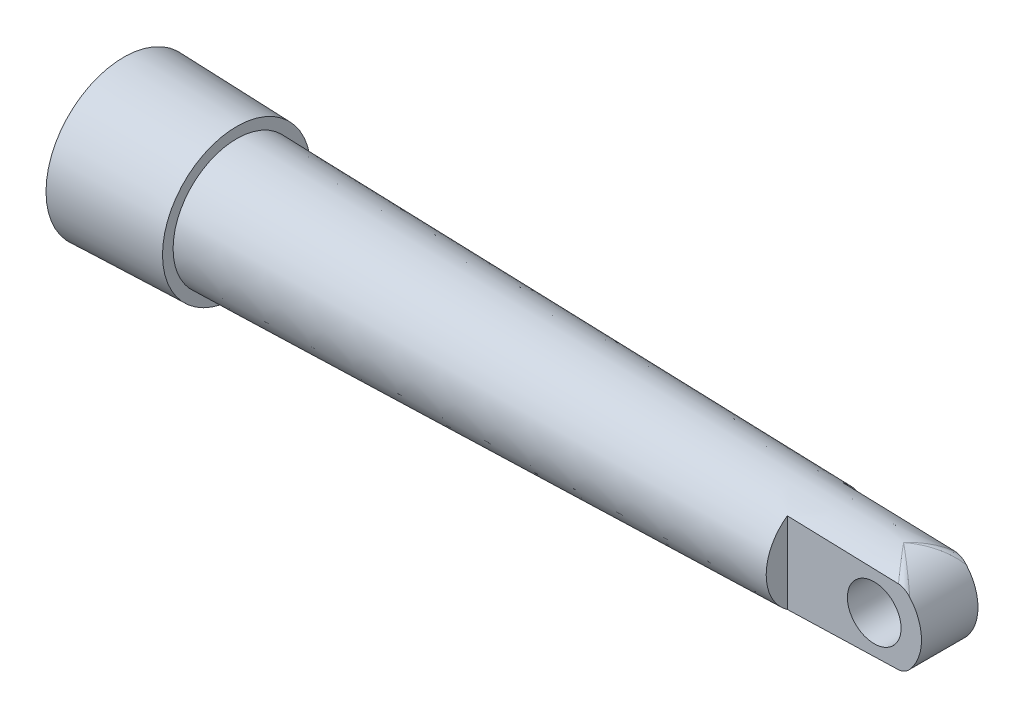
ISO-10303-21;
HEADER;
FILE_DESCRIPTION(('STEP AP214'),'2;1');
FILE_NAME('part.step','',(''),(''),'','','');
FILE_SCHEMA(('AUTOMOTIVE_DESIGN { 1 0 10303 214 1 1 1 1 }'));
ENDSEC;
DATA;
#1=APPLICATION_CONTEXT('core data for automotive mechanical design processes');
#2=APPLICATION_PROTOCOL_DEFINITION('international standard','automotive_design',2000,#1);
#3=PRODUCT_CONTEXT('',#1,'mechanical');
#4=PRODUCT('Part','Part','',(#3));
#5=PRODUCT_RELATED_PRODUCT_CATEGORY('part','',(#4));
#6=PRODUCT_DEFINITION_FORMATION('','',#4);
#7=PRODUCT_DEFINITION_CONTEXT('part definition',#1,'design');
#8=PRODUCT_DEFINITION('design','',#6,#7);
#9=PRODUCT_DEFINITION_SHAPE('','',#8);
#10=(LENGTH_UNIT() NAMED_UNIT(*) SI_UNIT(.MILLI.,.METRE.));
#11=(NAMED_UNIT(*) PLANE_ANGLE_UNIT() SI_UNIT($,.RADIAN.));
#12=(NAMED_UNIT(*) SI_UNIT($,.STERADIAN.) SOLID_ANGLE_UNIT());
#13=UNCERTAINTY_MEASURE_WITH_UNIT(LENGTH_MEASURE(1.E-05),#10,'distance_accuracy_value','');
#14=(GEOMETRIC_REPRESENTATION_CONTEXT(3) GLOBAL_UNCERTAINTY_ASSIGNED_CONTEXT((#13)) GLOBAL_UNIT_ASSIGNED_CONTEXT((#10,
#11,#12)) REPRESENTATION_CONTEXT('',''));
#15=CARTESIAN_POINT('',(0.,0.,0.));
#16=DIRECTION('',(0.,0.,1.));
#17=DIRECTION('',(1.,0.,0.));
#18=AXIS2_PLACEMENT_3D('',#15,#16,#17);
#19=CARTESIAN_POINT('',(27.5755104392082,0.,1.));
#20=DIRECTION('',(0.,0.,-1.));
#21=DIRECTION('',(-1.,0.,0.));
#22=AXIS2_PLACEMENT_3D('',#19,#20,#21);
#23=CYLINDRICAL_SURFACE('',#22,1.67448956079173);
#24=CARTESIAN_POINT('',(27.6163395055344,-1.67399171937721,0.));
#25=CARTESIAN_POINT('',(27.6163395055344,-1.67399171937721,0.));
#26=CARTESIAN_POINT('',(27.6163395055344,-1.67399171937721,0.));
#27=CARTESIAN_POINT('',(27.618467865516,-1.67393979547313,0.00174756455215632));
#28=CARTESIAN_POINT('',(27.6182772330823,-1.67394453160652,0.00193830383247855));
#29=CARTESIAN_POINT('',(27.6180865505114,-1.67394909581258,0.00212899180087379));
#30=CARTESIAN_POINT('',(27.6205963328864,-1.67388382036366,0.00349521727959526));
#31=CARTESIAN_POINT('',(27.6202150553893,-1.67389393219173,0.0038767024519865));
#32=CARTESIAN_POINT('',(27.6198336836377,-1.67390242153977,0.00425812769129189));
#33=CARTESIAN_POINT('',(27.8100496928767,-1.66854091525993,0.159052537947357));
#34=CARTESIAN_POINT('',(27.7927353072141,-1.66908591804656,0.17644826215915));
#35=CARTESIAN_POINT('',(27.7753447549881,-1.66938736127527,0.193774251036814));
#36=CARTESIAN_POINT('',(27.9981180453064,-1.63186028062121,0.313472648395745));
#37=CARTESIAN_POINT('',(27.9672353647476,-1.63757540436189,0.35100021500491));
#38=CARTESIAN_POINT('',(27.9297189554504,-1.63352712830547,0.382188470900751));
#39=CARTESIAN_POINT('',(28.2729335062419,-1.52565855161667,0.539119512416358));
#40=CARTESIAN_POINT('',(28.2202491945803,-1.5493387084512,0.604089290367832));
#41=CARTESIAN_POINT('',(28.1552987327416,-1.5283072420202,0.657901676800925));
#42=CARTESIAN_POINT('',(28.3648144755129,-1.48049703553556,0.614561601954931));
#43=CARTESIAN_POINT('',(28.306939142704,-1.51081510793,0.690805019945252));
#44=CARTESIAN_POINT('',(28.2307183925923,-1.48343417020061,0.750154804736638));
#45=CARTESIAN_POINT('',(28.542495965342,-1.3710128277063,0.760453215484456));
#46=CARTESIAN_POINT('',(28.4768648805257,-1.41693128005956,0.860781293345288));
#47=CARTESIAN_POINT('',(28.3765666311448,-1.37438521815399,0.928681207969344));
#48=CARTESIAN_POINT('',(28.6283197595258,-1.306769046583,0.830921849101678));
#49=CARTESIAN_POINT('',(28.5608616538924,-1.36063118457362,0.944803047149651));
#50=CARTESIAN_POINT('',(28.4470143137911,-1.31028882147814,1.01497734036455));
#51=CARTESIAN_POINT('',(28.7682063648431,-1.17804114166466,0.945780648261226));
#52=CARTESIAN_POINT('',(28.7005017863147,-1.24652107272812,1.08448470822755));
#53=CARTESIAN_POINT('',(28.5618389643624,-1.18165204916012,1.15572352149003));
#54=CARTESIAN_POINT('',(28.824514944723,-1.11847711627069,0.992014780924313));
#55=CARTESIAN_POINT('',(28.7583506370559,-1.19228819026752,1.14235076309022));
#56=CARTESIAN_POINT('',(28.6080593511837,-1.12207661067537,1.21240704281805));
#57=CARTESIAN_POINT('',(28.9304150161074,-0.987542432931758,1.07896774546127));
#58=CARTESIAN_POINT('',(28.870393646757,-1.07002880140056,1.25442709413737));
#59=CARTESIAN_POINT('',(28.6949864637875,-0.991005736391476,1.31905521106677));
#60=CARTESIAN_POINT('',(28.9799581084631,-0.916094068933119,1.11964683751816));
#61=CARTESIAN_POINT('',(28.9244893423867,-1.00134543268917,1.30853887770884));
#62=CARTESIAN_POINT('',(28.7356534615681,-0.919431822382247,1.36897142924673));
#63=CARTESIAN_POINT('',(29.0248446542775,-0.838657034925327,1.15650250885894));
#64=CARTESIAN_POINT('',(28.9742150615907,-0.926153112487724,1.35827938522685));
#65=CARTESIAN_POINT('',(28.7724981753761,-0.841805144419177,1.4142127847288));
#66=(BOUNDED_SURFACE() B_SPLINE_SURFACE(3,2,((#24,#25,#26),(#27,#28,#29),(#30,#31,#32),(#33,#34,
#35),(#36,#37,#38),(#39,#40,#41),(#42,#43,#44),(#45,#46,#47),(#48,#49,#50),(#51,#52,#53),(#54,
#55,#56),(#57,#58,#59),(#60,#61,#62),(#63,#64,#65)),.UNSPECIFIED.,.F.,.F.,
.F.) B_SPLINE_SURFACE_WITH_KNOTS((4,2,2,2,2,2,4),(3,3),(0.,0.00741482855342208,
0.659958824360603,0.997893522332798,1.33444977115564,1.5784949884056,1.82420360149986),(0.,1.),
.UNSPECIFIED.) GEOMETRIC_REPRESENTATION_ITEM() RATIONAL_B_SPLINE_SURFACE(((1.,1.,1.),(1.,
1.00000002001633,1.),(1.,0.999998807206265,1.),(1.,0.999781180759512,1.),(1.,0.990022032599264,
1.),(1.,0.961281322477562,1.),(1.,0.949014620749126,1.),(1.,0.920059473197017,1.),(1.,
0.903389267944706,1.),(1.,0.871801208689535,1.),(1.,0.857661218515058,1.),(1.,0.8286475690322,
1.),(1.,0.813769565984882,1.),(1.,0.799125837858268,1.))) REPRESENTATION_ITEM('') SURFACE());
#67=CARTESIAN_POINT('',(29.0248446542775,-0.838657034925327,1.15650250885894));
#68=CARTESIAN_POINT('',(28.9799581084631,-0.916094068933119,1.11964683751816));
#69=CARTESIAN_POINT('',(28.9304150161074,-0.987542432931758,1.07896774546127));
#70=CARTESIAN_POINT('',(28.824514944723,-1.11847711627069,0.992014780924313));
#71=CARTESIAN_POINT('',(28.7682063648431,-1.17804114166466,0.945780648261226));
#72=CARTESIAN_POINT('',(28.6283197595258,-1.306769046583,0.830921849101678));
#73=CARTESIAN_POINT('',(28.542495965342,-1.3710128277063,0.760453215484456));
#74=CARTESIAN_POINT('',(28.3648144755129,-1.48049703553556,0.614561601954931));
#75=CARTESIAN_POINT('',(28.2729335062419,-1.52565855161667,0.539119512416358));
#76=CARTESIAN_POINT('',(27.9981180453064,-1.63186028062121,0.313472648395745));
#77=CARTESIAN_POINT('',(27.8100496928767,-1.66854091525993,0.159052537947356));
#78=CARTESIAN_POINT('',(27.6205963328864,-1.67388382036366,0.00349521727959526));
#79=CARTESIAN_POINT('',(27.618467865516,-1.67393979547313,0.00174756455215632));
#80=CARTESIAN_POINT('',(27.6163395055344,-1.67399171937721,0.));
#81=B_SPLINE_CURVE_WITH_KNOTS('',3,(#67,#68,#69,#70,#71,#72,#73,#74,#75,#76,#77,#78,#79,#80),
.UNSPECIFIED.,.F.,.F.,(4,2,2,2,2,2,4),(0.,0.245708613094263,0.489753830344219,0.826310079167065,
1.16424477713926,1.81678877294644,1.82420360149986),.UNSPECIFIED.);
#82=CARTESIAN_POINT('',(28.8342401481649,-1.10431644422697,1.));
#83=VERTEX_POINT('',#82);
#84=CARTESIAN_POINT('',(27.6163395055344,-1.6739917193772,0.));
#85=VERTEX_POINT('',#84);
#86=EDGE_CURVE('E282',#83,#85,#81,.T.);
#87=ORIENTED_EDGE('',*,*,#86,.T.);
#88=CARTESIAN_POINT('',(27.6163395055344,-1.67399171937721,0.));
#89=CARTESIAN_POINT('',(27.6163395055344,-1.67399171937721,0.));
#90=CARTESIAN_POINT('',(27.6163395055344,-1.67399171937721,0.));
#91=CARTESIAN_POINT('',(27.6180865717008,-1.6739490965478,-0.00212901787747613));
#92=CARTESIAN_POINT('',(27.6182772481117,-1.67394451598897,-0.00193831885895451));
#93=CARTESIAN_POINT('',(27.6184678913302,-1.67393979610002,-0.00174758574121267));
#94=CARTESIAN_POINT('',(27.61983370472,-1.67390242220252,-0.00425815362703669));
#95=CARTESIAN_POINT('',(27.6202150703969,-1.67389391669551,-0.00387671744947991));
#96=CARTESIAN_POINT('',(27.6205963585702,-1.67388382091869,-0.00349523835504337));
#97=CARTESIAN_POINT('',(27.7590853330038,-1.66985933197192,-0.173959418116549));
#98=CARTESIAN_POINT('',(27.7746945755846,-1.66958988693492,-0.158402164601737));
#99=CARTESIAN_POINT('',(27.7902414432155,-1.66909944070916,-0.142788279856599));
#100=CARTESIAN_POINT('',(27.8969480134136,-1.64075553362338,-0.342193197571173));
#101=CARTESIAN_POINT('',(27.9299819662111,-1.64408919627779,-0.313735737268322));
#102=CARTESIAN_POINT('',(27.9581944242742,-1.6392628300472,-0.280691960244518));
#103=CARTESIAN_POINT('',(28.1082585022433,-1.55298683917737,-0.600386660038877));
#104=CARTESIAN_POINT('',(28.1666616555915,-1.57031837369283,-0.550485814627909));
#105=CARTESIAN_POINT('',(28.2156261412726,-1.55053227280001,-0.492065292313408));
#106=CARTESIAN_POINT('',(28.1843888754279,-1.51192678319757,-0.693480370503303));
#107=CARTESIAN_POINT('',(28.2537008605164,-1.53516689877234,-0.637550904828043));
#108=CARTESIAN_POINT('',(28.3083729461908,-1.50916096957166,-0.568218306509846));
#109=CARTESIAN_POINT('',(28.3321598012929,-1.41080178542038,-0.874306232748993));
#110=CARTESIAN_POINT('',(28.4246149048285,-1.44851705909491,-0.808515778603759));
#111=CARTESIAN_POINT('',(28.4883967745325,-1.40754473328141,-0.716033179125432));
#112=CARTESIAN_POINT('',(28.4038146649473,-1.35080157408243,-0.962055449159446));
#113=CARTESIAN_POINT('',(28.5092791373598,-1.39615025509978,-0.893205190086917));
#114=CARTESIAN_POINT('',(28.575691232484,-1.34736409042303,-0.787709352774784));
#115=CARTESIAN_POINT('',(28.5231997471348,-1.22759535321225,-1.1083512756071));
#116=CARTESIAN_POINT('',(28.6528467576888,-1.28780037393155,-1.03681550710535));
#117=CARTESIAN_POINT('',(28.7211336421899,-1.22399908525472,-0.907129939818906));
#118=CARTESIAN_POINT('',(28.5724593764793,-1.16886565738249,-1.16874709952427));
#119=CARTESIAN_POINT('',(28.7137097505298,-1.23488468627934,-1.09769660046548));
#120=CARTESIAN_POINT('',(28.7811448183085,-1.16525204906687,-0.956404218867904));
#121=CARTESIAN_POINT('',(28.6655028556776,-1.03872160430523,-1.28287438816999));
#122=CARTESIAN_POINT('',(28.8319556770654,-1.11495681008573,-1.21597769307738));
#123=CARTESIAN_POINT('',(28.8944962318526,-1.03519193336653,-1.04947536899053));
#124=CARTESIAN_POINT('',(28.7092501618559,-0.967229486118558,-1.33656135930656));
#125=CARTESIAN_POINT('',(28.8893055860095,-1.04722320578215,-1.27334465775722));
#126=CARTESIAN_POINT('',(28.947791949476,-0.963801842673637,-1.09323568552067));
#127=CARTESIAN_POINT('',(28.7491691889188,-0.889214551320577,-1.38557006974672));
#128=CARTESIAN_POINT('',(28.9423211997568,-0.972728060609255,-1.32637603822938));
#129=CARTESIAN_POINT('',(28.9964238168984,-0.885957370476444,-1.13316658441293));
#130=(BOUNDED_SURFACE() B_SPLINE_SURFACE(3,2,((#88,#89,#90),(#91,#92,#93),(#94,#95,#96),(#97,
#98,#99),(#100,#101,#102),(#103,#104,#105),(#106,#107,#108),(#109,#110,#111),(#112,#113,#114),
(#115,#116,#117),(#118,#119,#120),(#121,#122,#123),(#124,#125,#126),(#127,#128,#129)),
.UNSPECIFIED.,.F.,.F.,.F.) B_SPLINE_SURFACE_WITH_KNOTS((4,2,2,2,2,2,4),(3,3),(0.,
0.00741482855311148,0.590964029095096,0.928825723040097,1.26554500889048,1.51884965246426,
1.77375390207447),(0.,1.),
.UNSPECIFIED.) GEOMETRIC_REPRESENTATION_ITEM() RATIONAL_B_SPLINE_SURFACE(((1.,1.,1.),(1.,
1.00000001480827,1.),(1.,0.999998802039772,1.),(1.,0.999804338923053,1.),(1.,0.99201160272251,
1.),(1.,0.968025575817148,1.),(1.,0.956750451752726,1.),(1.,0.929639219900715,1.),(1.,
0.913818663027909,1.),(1.,0.882919998060971,1.),(1.,0.868628855709581,1.),(1.,0.838952739397176,
1.),(1.,0.823561427855335,1.),(1.,0.808199336500256,1.))) REPRESENTATION_ITEM('') SURFACE());
#131=CARTESIAN_POINT('',(28.9964238168984,-0.885957370476444,-1.13316658441293));
#132=CARTESIAN_POINT('',(28.947791949476,-0.963801842673637,-1.09323568552067));
#133=CARTESIAN_POINT('',(28.8944962318526,-1.03519193336653,-1.04947536899053));
#134=CARTESIAN_POINT('',(28.7811448183085,-1.16525204906687,-0.956404218867903));
#135=CARTESIAN_POINT('',(28.7211336421899,-1.22399908525472,-0.907129939818906));
#136=CARTESIAN_POINT('',(28.575691232484,-1.34736409042303,-0.787709352774784));
#137=CARTESIAN_POINT('',(28.4883967745325,-1.40754473328141,-0.716033179125432));
#138=CARTESIAN_POINT('',(28.3083729461908,-1.50916096957166,-0.568218306509846));
#139=CARTESIAN_POINT('',(28.2156261412726,-1.55053227280001,-0.492065292313408));
#140=CARTESIAN_POINT('',(27.9581944242741,-1.6392628300472,-0.280691960244518));
#141=CARTESIAN_POINT('',(27.7902414432155,-1.66909944070916,-0.142788279856601));
#142=CARTESIAN_POINT('',(27.6205963585702,-1.67388382091869,-0.00349523835504337));
#143=CARTESIAN_POINT('',(27.6184678913302,-1.67393979610002,-0.00174758574121267));
#144=CARTESIAN_POINT('',(27.6163395055344,-1.67399171937721,0.));
#145=B_SPLINE_CURVE_WITH_KNOTS('',3,(#131,#132,#133,#134,#135,#136,#137,#138,#139,#140,#141,
#142,#143,#144),.UNSPECIFIED.,.F.,.F.,(4,2,2,2,2,2,4),(0.,0.254904249610207,0.508208893183989,
0.844928179034372,1.18278987297937,1.76633907352136,1.77375390207447),.UNSPECIFIED.);
#146=CARTESIAN_POINT('',(28.834240148164,-1.10431644422803,-1.));
#147=VERTEX_POINT('',#146);
#148=EDGE_CURVE('E62',#85,#147,#145,.F.);
#149=ORIENTED_EDGE('',*,*,#148,.T.);
#150=CARTESIAN_POINT('',(27.5755104392082,0.,-1.));
#151=DIRECTION('',(0.,0.,1.));
#152=DIRECTION('',(1.,0.,0.));
#153=AXIS2_PLACEMENT_3D('',#150,#151,#152);
#154=CIRCLE('',#153,1.67448956079173);
#155=CARTESIAN_POINT('',(28.8342401481649,1.10431644422698,-1.));
#156=VERTEX_POINT('',#155);
#157=EDGE_CURVE('E138',#147,#156,#154,.T.);
#158=ORIENTED_EDGE('',*,*,#157,.T.);
#159=CARTESIAN_POINT('',(27.6163395055344,1.67399171937718,0.));
#160=CARTESIAN_POINT('',(27.6163395055344,1.6739917193772,0.));
#161=CARTESIAN_POINT('',(27.6163395055344,1.67399171937721,0.));
#162=CARTESIAN_POINT('',(27.6184678655146,1.67393979547315,-0.00174756455328493));
#163=CARTESIAN_POINT('',(27.6182772330811,1.67394453160654,-0.00193830383373032));
#164=CARTESIAN_POINT('',(27.6180865505103,1.6739490958126,-0.00212899180224874));
#165=CARTESIAN_POINT('',(27.6205963328837,1.67388382036371,-0.00349521728182946));
#166=CARTESIAN_POINT('',(27.6202150553868,1.67389393219177,-0.00387670245446452));
#167=CARTESIAN_POINT('',(27.6198336836354,1.67390242153982,-0.00425812769401374));
#168=CARTESIAN_POINT('',(27.8100496927564,1.6685409152633,-0.159052538045979));
#169=CARTESIAN_POINT('',(27.7927353071045,1.6690859180492,-0.176448262268558));
#170=CARTESIAN_POINT('',(27.7753447548892,1.66938736127723,-0.193774251156961));
#171=CARTESIAN_POINT('',(27.9981180452837,1.63186028062186,-0.313472648414101));
#172=CARTESIAN_POINT('',(27.9672353647267,1.63757540436241,-0.351000215025471));
#173=CARTESIAN_POINT('',(27.9297189554318,1.63352712830585,-0.382188470923113));
#174=CARTESIAN_POINT('',(28.2729335062533,1.52565855161642,-0.539119512406684));
#175=CARTESIAN_POINT('',(28.2202491945912,1.549338708451,-0.604089290356672));
#176=CARTESIAN_POINT('',(28.155298732751,1.52830724202009,-0.657901676789139));
#177=CARTESIAN_POINT('',(28.3648144755158,1.48049703553555,-0.614561601952296));
#178=CARTESIAN_POINT('',(28.3069391427068,1.51081510792999,-0.690805019942174));
#179=CARTESIAN_POINT('',(28.2307183925947,1.48343417020062,-0.750154804733427));
#180=CARTESIAN_POINT('',(28.5424959653387,1.37101282770647,-0.760453215486885));
#181=CARTESIAN_POINT('',(28.4768648805225,1.41693128005971,-0.860781293348218));
#182=CARTESIAN_POINT('',(28.3765666311421,1.37438521815412,-0.928681207972303));
#183=CARTESIAN_POINT('',(28.6283197595249,1.30676904658315,-0.830921849102174));
#184=CARTESIAN_POINT('',(28.5608616538914,1.36063118457375,-0.944803047150262));
#185=CARTESIAN_POINT('',(28.4470143137904,1.31028882147828,-1.01497734036515));
#186=CARTESIAN_POINT('',(28.7682063648434,1.17804114166485,-0.945780648260609));
#187=CARTESIAN_POINT('',(28.7005017863151,1.24652107272829,-1.08448470822677));
#188=CARTESIAN_POINT('',(28.5618389643627,1.18165204916031,-1.15572352148927));
#189=CARTESIAN_POINT('',(28.8245149447231,1.11847711627094,-0.992014780923907));
#190=CARTESIAN_POINT('',(28.7583506370559,1.19228819026774,-1.14235076308969));
#191=CARTESIAN_POINT('',(28.6080593511837,1.12207661067561,-1.21240704281756));
#192=CARTESIAN_POINT('',(28.9304150161069,0.987542432932033,-1.07896774546134));
#193=CARTESIAN_POINT('',(28.8703936467564,1.07002880140082,-1.25442709413748));
#194=CARTESIAN_POINT('',(28.6949864637871,0.991005736391741,-1.31905521106686));
#195=CARTESIAN_POINT('',(28.9799581084624,0.916094068933365,-1.1196468375185));
#196=CARTESIAN_POINT('',(28.9244893423859,1.00134543268941,-1.3085388777093));
#197=CARTESIAN_POINT('',(28.7356534615675,0.91943182238248,-1.36897142924715));
#198=CARTESIAN_POINT('',(29.0248446542774,0.838657034925511,-1.15650250885886));
#199=CARTESIAN_POINT('',(28.9742150615905,0.926153112487903,-1.35827938522673));
#200=CARTESIAN_POINT('',(28.772498175376,0.841805144419355,-1.4142127847287));
#201=(BOUNDED_SURFACE() B_SPLINE_SURFACE(3,2,((#159,#160,#161),(#162,#163,#164),(#165,#166,
#167),(#168,#169,#170),(#171,#172,#173),(#174,#175,#176),(#177,#178,#179),(#180,#181,#182),
(#183,#184,#185),(#186,#187,#188),(#189,#190,#191),(#192,#193,#194),(#195,#196,#197),(#198,#199,
#200)),.UNSPECIFIED.,.F.,.F.,.F.) B_SPLINE_SURFACE_WITH_KNOTS((4,2,2,2,2,2,4),(3,3),(0.,
0.00741482855341907,0.659958824360341,0.997893522332674,1.33444977115538,1.57849498840523,
1.82420360149967),(0.,1.),
.UNSPECIFIED.) GEOMETRIC_REPRESENTATION_ITEM() RATIONAL_B_SPLINE_SURFACE(((1.,1.,1.),(1.,
1.00000002001633,1.),(1.,0.999998807206265,1.),(1.,0.999781180759513,1.),(1.,0.990022032599272,
1.),(1.,0.961281322477586,1.),(1.,0.949014620749148,1.),(1.,0.920059473197042,1.),(1.,
0.90338926794474,1.),(1.,0.871801208689587,1.),(1.,0.857661218515119,1.),(1.,0.828647569032259,
1.),(1.,0.81376956598493,1.),(1.,0.799125837858304,1.))) REPRESENTATION_ITEM('') SURFACE());
#202=CARTESIAN_POINT('',(29.0248446542774,0.838657034925511,-1.15650250885886));
#203=CARTESIAN_POINT('',(28.9799581084624,0.916094068933365,-1.1196468375185));
#204=CARTESIAN_POINT('',(28.9304150161069,0.987542432932033,-1.07896774546134));
#205=CARTESIAN_POINT('',(28.8245149447231,1.11847711627094,-0.992014780923906));
#206=CARTESIAN_POINT('',(28.7682063648434,1.17804114166485,-0.945780648260609));
#207=CARTESIAN_POINT('',(28.6283197595249,1.30676904658315,-0.830921849102174));
#208=CARTESIAN_POINT('',(28.5424959653387,1.37101282770647,-0.760453215486885));
#209=CARTESIAN_POINT('',(28.3648144755158,1.48049703553555,-0.614561601952296));
#210=CARTESIAN_POINT('',(28.2729335062533,1.52565855161642,-0.539119512406684));
#211=CARTESIAN_POINT('',(27.9981180452837,1.63186028062186,-0.313472648414101));
#212=CARTESIAN_POINT('',(27.8100496927564,1.6685409152633,-0.159052538045978));
#213=CARTESIAN_POINT('',(27.6205963328837,1.67388382036371,-0.00349521728182946));
#214=CARTESIAN_POINT('',(27.6184678655146,1.67393979547315,-0.00174756455328493));
#215=CARTESIAN_POINT('',(27.6163395055344,1.67399171937718,0.));
#216=B_SPLINE_CURVE_WITH_KNOTS('',3,(#202,#203,#204,#205,#206,#207,#208,#209,#210,#211,#212,
#213,#214,#215),.UNSPECIFIED.,.F.,.F.,(4,2,2,2,2,2,4),(0.,0.245708613094438,0.489753830344288,
0.826310079166995,1.16424477713933,1.81678877294625,1.82420360149967),.UNSPECIFIED.);
#217=CARTESIAN_POINT('',(27.6163395055344,1.67399171937718,0.));
#218=VERTEX_POINT('',#217);
#219=EDGE_CURVE('E270',#156,#218,#216,.T.);
#220=ORIENTED_EDGE('',*,*,#219,.T.);
#221=CARTESIAN_POINT('',(27.6163395055344,1.67399171937721,0.));
#222=CARTESIAN_POINT('',(27.6163395055344,1.6739917193772,0.));
#223=CARTESIAN_POINT('',(27.6163395055344,1.67399171937718,0.));
#224=CARTESIAN_POINT('',(27.6180865716997,1.67394909654782,0.00212901787884273));
#225=CARTESIAN_POINT('',(27.6182772481105,1.67394451598899,0.00193831886019869));
#226=CARTESIAN_POINT('',(27.6184678913288,1.67393979610003,0.00174758574233443));
#227=CARTESIAN_POINT('',(27.6198337047178,1.67390242220257,0.00425815362973901));
#228=CARTESIAN_POINT('',(27.6202150703944,1.67389391669556,0.00387671745194016));
#229=CARTESIAN_POINT('',(27.6205963585675,1.67388382091874,0.00349523835726155));
#230=CARTESIAN_POINT('',(27.7590853329162,1.66985933197365,0.173959418223239));
#231=CARTESIAN_POINT('',(27.7746945754874,1.66958988693728,0.158402164698888));
#232=CARTESIAN_POINT('',(27.7902414431089,1.66909944071213,0.142788279944174));
#233=CARTESIAN_POINT('',(27.896948013396,1.64075553362372,0.342193197592568));
#234=CARTESIAN_POINT('',(27.9299819661914,1.64408919627826,0.313735737287957));
#235=CARTESIAN_POINT('',(27.9581944242527,1.6392628300478,0.28069196026208));
#236=CARTESIAN_POINT('',(28.1082585022534,1.55298683917715,0.600386660026578));
#237=CARTESIAN_POINT('',(28.1666616556031,1.57031837369253,0.550485814616341));
#238=CARTESIAN_POINT('',(28.2156261412849,1.55053227279965,0.492065292303313));
#239=CARTESIAN_POINT('',(28.1843888754306,1.51192678319748,0.693480370500103));
#240=CARTESIAN_POINT('',(28.2537008605195,1.53516689877223,0.637550904824997));
#241=CARTESIAN_POINT('',(28.3083729461941,1.50916096957154,0.568218306507219));
#242=CARTESIAN_POINT('',(28.3321598012902,1.41080178542038,0.874306232752352));
#243=CARTESIAN_POINT('',(28.4246149048253,1.44851705909495,0.808515778607044));
#244=CARTESIAN_POINT('',(28.4883967745292,1.40754473328146,0.716033179128188));
#245=CARTESIAN_POINT('',(28.4038146649467,1.35080157408241,0.962055449160306));
#246=CARTESIAN_POINT('',(28.5092791373589,1.39615025509978,0.893205190087771));
#247=CARTESIAN_POINT('',(28.5756912324832,1.34736409042303,0.78770935277549));
#248=CARTESIAN_POINT('',(28.5231997471353,1.22759535321227,1.10835127560644));
#249=CARTESIAN_POINT('',(28.6528467576894,1.28780037393156,1.03681550710468));
#250=CARTESIAN_POINT('',(28.7211336421905,1.22399908525474,0.90712993981837));
#251=CARTESIAN_POINT('',(28.5724593764795,1.16886565738255,1.16874709952389));
#252=CARTESIAN_POINT('',(28.7137097505301,1.2348846862794,1.09769660046508));
#253=CARTESIAN_POINT('',(28.7811448183087,1.16525204906694,0.956404218867593));
#254=CARTESIAN_POINT('',(28.6655028556773,1.03872160430532,1.28287438817024));
#255=CARTESIAN_POINT('',(28.831955677065,1.11495681008582,1.21597769307765));
#256=CARTESIAN_POINT('',(28.8944962318522,1.03519193336663,1.04947536899074));
#257=CARTESIAN_POINT('',(28.7092501618553,0.967229486118614,1.33656135930716));
#258=CARTESIAN_POINT('',(28.8893055860088,1.04722320578221,1.27334465775788));
#259=CARTESIAN_POINT('',(28.9477919494753,0.963801842673708,1.09323568552116));
#260=CARTESIAN_POINT('',(28.7491691889188,0.889214551320578,1.38557006974672));
#261=CARTESIAN_POINT('',(28.9423211997568,0.972728060609259,1.32637603822938));
#262=CARTESIAN_POINT('',(28.9964238168983,0.885957370476451,1.13316658441293));
#263=(BOUNDED_SURFACE() B_SPLINE_SURFACE(3,2,((#221,#222,#223),(#224,#225,#226),(#227,#228,
#229),(#230,#231,#232),(#233,#234,#235),(#236,#237,#238),(#239,#240,#241),(#242,#243,#244),
(#245,#246,#247),(#248,#249,#250),(#251,#252,#253),(#254,#255,#256),(#257,#258,#259),(#260,#261,
#262)),.UNSPECIFIED.,.F.,.F.,.F.) B_SPLINE_SURFACE_WITH_KNOTS((4,2,2,2,2,2,4),(3,3),(0.,
0.00741482855311359,0.590964029095083,0.928825723040218,1.26554500889047,1.5188496524641,
1.77375390207446),(0.,1.),
.UNSPECIFIED.) GEOMETRIC_REPRESENTATION_ITEM() RATIONAL_B_SPLINE_SURFACE(((1.,1.,1.),(1.,
1.00000001480827,1.),(1.,0.999998802039772,1.),(1.,0.999804338923053,1.),(1.,0.992011602722511,
1.),(1.,0.968025575817147,1.),(1.,0.95675045175272,1.),(1.,0.929639219900706,1.),(1.,
0.913818663027905,1.),(1.,0.882919998060981,1.),(1.,0.868628855709601,1.),(1.,0.838952739397198,
1.),(1.,0.823561427855348,1.),(1.,0.808199336500259,1.))) REPRESENTATION_ITEM('') SURFACE());
#264=CARTESIAN_POINT('',(28.9964238168983,0.885957370476451,1.13316658441293));
#265=CARTESIAN_POINT('',(28.9477919494753,0.963801842673708,1.09323568552116));
#266=CARTESIAN_POINT('',(28.8944962318522,1.03519193336663,1.04947536899074));
#267=CARTESIAN_POINT('',(28.7811448183087,1.16525204906694,0.956404218867593));
#268=CARTESIAN_POINT('',(28.7211336421905,1.22399908525474,0.90712993981837));
#269=CARTESIAN_POINT('',(28.5756912324832,1.34736409042303,0.78770935277549));
#270=CARTESIAN_POINT('',(28.4883967745292,1.40754473328146,0.716033179128188));
#271=CARTESIAN_POINT('',(28.3083729461941,1.50916096957154,0.568218306507219));
#272=CARTESIAN_POINT('',(28.2156261412849,1.55053227279965,0.492065292303313));
#273=CARTESIAN_POINT('',(27.9581944242527,1.6392628300478,0.28069196026208));
#274=CARTESIAN_POINT('',(27.7902414431088,1.66909944071214,0.142788279944175));
#275=CARTESIAN_POINT('',(27.6205963585675,1.67388382091874,0.00349523835726155));
#276=CARTESIAN_POINT('',(27.6184678913288,1.67393979610003,0.00174758574233443));
#277=CARTESIAN_POINT('',(27.6163395055344,1.67399171937718,0.));
#278=B_SPLINE_CURVE_WITH_KNOTS('',3,(#264,#265,#266,#267,#268,#269,#270,#271,#272,#273,#274,
#275,#276,#277),.UNSPECIFIED.,.F.,.F.,(4,2,2,2,2,2,4),(0.,0.25490424961036,0.508208893183991,
0.844928179034242,1.18278987297938,1.76633907352135,1.77375390207446),.UNSPECIFIED.);
#279=CARTESIAN_POINT('',(28.8342401481649,1.10431644422697,1.));
#280=VERTEX_POINT('',#279);
#281=EDGE_CURVE('E277',#218,#280,#278,.F.);
#282=ORIENTED_EDGE('',*,*,#281,.T.);
#283=CARTESIAN_POINT('',(27.5755104392082,0.,1.));
#284=DIRECTION('',(0.,0.,1.));
#285=DIRECTION('',(1.,0.,0.));
#286=AXIS2_PLACEMENT_3D('',#283,#284,#285);
#287=CIRCLE('',#286,1.67448956079173);
#288=EDGE_CURVE('E135',#83,#280,#287,.T.);
#289=ORIENTED_EDGE('',*,*,#288,.F.);
#290=EDGE_LOOP('',(#87,#149,#158,#220,#282,#289));
#291=FACE_BOUND('',#290,.T.);
#292=ADVANCED_FACE('F34',(#291),#23,.T.);
#293=CARTESIAN_POINT('',(27.5755104392082,0.,1.));
#294=DIRECTION('',(0.,0.,1.));
#295=DIRECTION('',(1.,0.,0.));
#296=AXIS2_PLACEMENT_3D('',#293,#294,#295);
#297=PLANE('',#296);
#298=CARTESIAN_POINT('',(27.5755104392082,0.,1.));
#299=DIRECTION('',(0.,0.,1.));
#300=DIRECTION('',(1.,0.,0.));
#301=AXIS2_PLACEMENT_3D('',#298,#299,#300);
#302=CIRCLE('',#301,0.950000000000001);
#303=CARTESIAN_POINT('',(28.5255104392082,0.,1.));
#304=VERTEX_POINT('',#303);
#305=EDGE_CURVE('E345',#304,#304,#302,.T.);
#306=ORIENTED_EDGE('',*,*,#305,.F.);
#307=EDGE_LOOP('',(#306));
#308=FACE_BOUND('',#307,.T.);
#309=CARTESIAN_POINT('',(21.7102072032094,-1.51831584078501,1.));
#310=CARTESIAN_POINT('',(22.8391463453271,-1.48533563420197,1.));
#311=CARTESIAN_POINT('',(23.9680766740742,-1.45204871287401,1.));
#312=CARTESIAN_POINT('',(26.2259134332759,-1.38467406252055,1.));
#313=CARTESIAN_POINT('',(27.3548198637301,-1.35058633348068,1.));
#314=CARTESIAN_POINT('',(29.4201463246805,-1.28731828524476,1.));
#315=CARTESIAN_POINT('',(30.3565710664904,-1.25829207379386,1.));
#316=CARTESIAN_POINT('',(32.2293939849435,-1.19939947672683,1.));
#317=CARTESIAN_POINT('',(33.1657921615916,-1.16953309126778,1.));
#318=CARTESIAN_POINT('',(35.0385563822115,-1.10875709426822,1.));
#319=CARTESIAN_POINT('',(35.9749224261276,-1.07784748100043,1.));
#320=CARTESIAN_POINT('',(37.8476086340023,-1.01465089535471,1.));
#321=CARTESIAN_POINT('',(38.7839287979271,-0.982363921973083,1.));
#322=CARTESIAN_POINT('',(39.7202192411298,-0.949221200748731,1.));
#323=B_SPLINE_CURVE_WITH_KNOTS('',3,(#309,#310,#311,#312,#313,#314,#315,#316,#317,#318,#319,
#320,#321,#322),.UNSPECIFIED.,.F.,.F.,(4,2,2,2,2,2,4),(0.,3.38826249988228,6.77652506054353,
9.58714822649439,12.3977708669317,15.2083981611334,18.0190275034902),.UNSPECIFIED.);
#324=CARTESIAN_POINT('',(24.5,-1.43614066163451,1.));
#325=VERTEX_POINT('',#324);
#326=CARTESIAN_POINT('',(28.4347748296507,-1.31750326421703,1.));
#327=VERTEX_POINT('',#326);
#328=EDGE_CURVE('E99',#325,#327,#323,.T.);
#329=ORIENTED_EDGE('',*,*,#328,.T.);
#330=CARTESIAN_POINT('',(28.4347748296507,-1.31750326421703,1.00000000000003));
#331=CARTESIAN_POINT('',(28.4564415660138,-1.3168133327505,1.00000000000001));
#332=CARTESIAN_POINT('',(28.4779581932642,-1.31427667133332,1.));
#333=CARTESIAN_POINT('',(28.5202535027866,-1.30608956717876,0.999999999999997));
#334=CARTESIAN_POINT('',(28.5410361591616,-1.30046007092847,0.999999999999999));
#335=CARTESIAN_POINT('',(28.5919172228419,-1.28318120458633,1.));
#336=CARTESIAN_POINT('',(28.6214655328482,-1.26992885987503,1.));
#337=CARTESIAN_POINT('',(28.6781892823379,-1.23881407839652,1.));
#338=CARTESIAN_POINT('',(28.7053503135785,-1.22092592166845,1.));
#339=CARTESIAN_POINT('',(28.7499319797824,-1.18676989845707,1.));
#340=CARTESIAN_POINT('',(28.7680140167114,-1.1713496296934,1.));
#341=CARTESIAN_POINT('',(28.8024092561327,-1.13895300107411,1.));
#342=CARTESIAN_POINT('',(28.8187374601618,-1.12199259513775,1.));
#343=CARTESIAN_POINT('',(28.8342401481649,-1.10431644422697,1.));
#344=B_SPLINE_CURVE_WITH_KNOTS('',3,(#330,#331,#332,#333,#334,#335,#336,#337,#338,#339,#340,
#341,#342,#343),.UNSPECIFIED.,.F.,.F.,(4,2,2,2,2,2,4),(0.,0.0648182347505609,0.12920279928921,
0.225848623084911,0.323042575783734,0.394224728912254,0.464739153261863),.UNSPECIFIED.);
#345=EDGE_CURVE('E11',#327,#83,#344,.T.);
#346=ORIENTED_EDGE('',*,*,#345,.T.);
#347=ORIENTED_EDGE('',*,*,#288,.T.);
#348=CARTESIAN_POINT('',(28.8342401481649,1.10431644422697,1.));
#349=CARTESIAN_POINT('',(28.8079093048438,1.13431966740773,1.));
#350=CARTESIAN_POINT('',(28.7790860276818,1.16240310589315,1.));
#351=CARTESIAN_POINT('',(28.7165484618932,1.21355647596271,1.));
#352=CARTESIAN_POINT('',(28.6827640169241,1.23654007394369,1.));
#353=CARTESIAN_POINT('',(28.6232577331484,1.26877342991923,1.));
#354=CARTESIAN_POINT('',(28.5986323810322,1.28004400115622,1.));
#355=CARTESIAN_POINT('',(28.5480701435757,1.29860086179257,1.));
#356=CARTESIAN_POINT('',(28.5221444831803,1.30591640675709,1.));
#357=CARTESIAN_POINT('',(28.4857321699132,1.31267670333287,1.));
#358=CARTESIAN_POINT('',(28.4756138035732,1.31419106024465,1.));
#359=CARTESIAN_POINT('',(28.4552628823383,1.31644787268419,1.));
#360=CARTESIAN_POINT('',(28.4450300836067,1.3171881078862,1.));
#361=CARTESIAN_POINT('',(28.4347748296507,1.31750326421707,1.));
#362=B_SPLINE_CURVE_WITH_KNOTS('',3,(#348,#349,#350,#351,#352,#353,#354,#355,#356,#357,#358,
#359,#360,#361),.UNSPECIFIED.,.F.,.F.,(4,2,2,2,2,2,4),(0.,0.119969076342463,0.241835888955987,
0.322827188516985,0.403210895793579,0.433878961095777,0.464634748889424),.UNSPECIFIED.);
#363=CARTESIAN_POINT('',(28.4347748296507,1.31750326421703,1.));
#364=VERTEX_POINT('',#363);
#365=EDGE_CURVE('E47',#280,#364,#362,.T.);
#366=ORIENTED_EDGE('',*,*,#365,.T.);
#367=CARTESIAN_POINT('',(21.7102072032094,1.51831584078502,1.));
#368=CARTESIAN_POINT('',(22.8391463453271,1.48533563420197,1.));
#369=CARTESIAN_POINT('',(23.9680766740742,1.45204871287401,1.));
#370=CARTESIAN_POINT('',(26.2259134332759,1.38467406252055,1.));
#371=CARTESIAN_POINT('',(27.3548198637301,1.35058633348068,1.));
#372=CARTESIAN_POINT('',(29.4201463246805,1.28731828524475,1.));
#373=CARTESIAN_POINT('',(30.3565710664904,1.25829207379386,1.));
#374=CARTESIAN_POINT('',(32.2293939849435,1.19939947672682,1.));
#375=CARTESIAN_POINT('',(33.1657921615916,1.16953309126777,1.));
#376=CARTESIAN_POINT('',(35.0385563822115,1.10875709426821,1.));
#377=CARTESIAN_POINT('',(35.9749224261276,1.07784748100043,1.));
#378=CARTESIAN_POINT('',(37.8476086340024,1.01465089535471,1.));
#379=CARTESIAN_POINT('',(38.7839287979271,0.982363921973075,1.));
#380=CARTESIAN_POINT('',(39.7202192411298,0.949221200748723,1.));
#381=B_SPLINE_CURVE_WITH_KNOTS('',3,(#367,#368,#369,#370,#371,#372,#373,#374,#375,#376,#377,
#378,#379,#380),.UNSPECIFIED.,.F.,.F.,(4,2,2,2,2,2,4),(0.,3.38826249988228,6.77652506054353,
9.5871482264944,12.3977708669317,15.2083981611335,18.0190275034902),.UNSPECIFIED.);
#382=CARTESIAN_POINT('',(24.5,1.43614066163451,1.));
#383=VERTEX_POINT('',#382);
#384=EDGE_CURVE('E110',#364,#383,#381,.F.);
#385=ORIENTED_EDGE('',*,*,#384,.T.);
#386=DIRECTION('',(0.,-1.,0.));
#387=VECTOR('',#386,1.);
#388=CARTESIAN_POINT('',(24.5,1.75,1.));
#389=LINE('',#388,#387);
#390=EDGE_CURVE('E116',#383,#325,#389,.T.);
#391=ORIENTED_EDGE('',*,*,#390,.T.);
#392=EDGE_LOOP('',(#329,#346,#347,#366,#385,#391));
#393=FACE_BOUND('',#392,.T.);
#394=ADVANCED_FACE('F120',(#308,#393),#297,.T.);
#395=CARTESIAN_POINT('',(27.5755104392082,0.,-1.));
#396=DIRECTION('',(0.,0.,1.));
#397=DIRECTION('',(1.,0.,0.));
#398=AXIS2_PLACEMENT_3D('',#395,#396,#397);
#399=PLANE('',#398);
#400=CARTESIAN_POINT('',(27.5755104392082,0.,-1.));
#401=DIRECTION('',(0.,0.,1.));
#402=DIRECTION('',(1.,0.,0.));
#403=AXIS2_PLACEMENT_3D('',#400,#401,#402);
#404=CIRCLE('',#403,0.950000000000001);
#405=CARTESIAN_POINT('',(28.5255104392082,0.,-1.));
#406=VERTEX_POINT('',#405);
#407=EDGE_CURVE('E111',#406,#406,#404,.T.);
#408=ORIENTED_EDGE('',*,*,#407,.T.);
#409=EDGE_LOOP('',(#408));
#410=FACE_BOUND('',#409,.T.);
#411=ORIENTED_EDGE('',*,*,#157,.F.);
#412=CARTESIAN_POINT('',(28.834240148164,-1.10431644422803,-0.999999999999231));
#413=CARTESIAN_POINT('',(28.80770202192,-1.13455534400192,-0.999999999999726));
#414=CARTESIAN_POINT('',(28.7786287714664,-1.16284791054785,-0.999999999999927));
#415=CARTESIAN_POINT('',(28.7155141735697,-1.214328487051,-1.00000000000007));
#416=CARTESIAN_POINT('',(28.681400754989,-1.23742754497806,-1.00000000000002));
#417=CARTESIAN_POINT('',(28.6215403321359,-1.26959994266509,-0.99999999999999));
#418=CARTESIAN_POINT('',(28.5969211315706,-1.28076842933267,-0.999999999999997));
#419=CARTESIAN_POINT('',(28.5463852906307,-1.29911674917105,-1.));
#420=CARTESIAN_POINT('',(28.5204798471473,-1.30632605515719,-1.));
#421=CARTESIAN_POINT('',(28.4843621475175,-1.31288927132957,-1.));
#422=CARTESIAN_POINT('',(28.4745129739476,-1.31433301319053,-1.));
#423=CARTESIAN_POINT('',(28.454707981585,-1.31648779917621,-1.));
#424=CARTESIAN_POINT('',(28.4447519431408,-1.31719680526746,-1.));
#425=CARTESIAN_POINT('',(28.4347748296507,-1.31750326421706,-1.));
#426=B_SPLINE_CURVE_WITH_KNOTS('',3,(#412,#413,#414,#415,#416,#417,#418,#419,#420,#421,#422,
#423,#424,#425),.UNSPECIFIED.,.F.,.F.,(4,2,2,2,2,2,4),(0.,0.120921821640193,0.243779121320971,
0.324626814217093,0.40486421045896,0.434704368891307,0.464627079133645),.UNSPECIFIED.);
#427=CARTESIAN_POINT('',(28.4347748296507,-1.31750326421702,-1.));
#428=VERTEX_POINT('',#427);
#429=EDGE_CURVE('E181',#147,#428,#426,.T.);
#430=ORIENTED_EDGE('',*,*,#429,.T.);
#431=CARTESIAN_POINT('',(21.7102072032094,-1.51831584078501,-1.));
#432=CARTESIAN_POINT('',(22.8391463453271,-1.48533563420197,-1.));
#433=CARTESIAN_POINT('',(23.9680766740742,-1.45204871287401,-1.));
#434=CARTESIAN_POINT('',(26.2259134332759,-1.38467406252055,-1.));
#435=CARTESIAN_POINT('',(27.3548198637301,-1.35058633348068,-1.));
#436=CARTESIAN_POINT('',(29.4201463246805,-1.28731828524476,-1.));
#437=CARTESIAN_POINT('',(30.3565710664904,-1.25829207379386,-1.));
#438=CARTESIAN_POINT('',(32.2293939849435,-1.19939947672683,-1.));
#439=CARTESIAN_POINT('',(33.1657921615916,-1.16953309126778,-1.));
#440=CARTESIAN_POINT('',(35.0385563822115,-1.10875709426822,-1.));
#441=CARTESIAN_POINT('',(35.9749224261276,-1.07784748100043,-1.));
#442=CARTESIAN_POINT('',(37.8476086340023,-1.01465089535471,-1.));
#443=CARTESIAN_POINT('',(38.7839287979271,-0.982363921973083,-1.));
#444=CARTESIAN_POINT('',(39.7202192411298,-0.949221200748731,-1.));
#445=B_SPLINE_CURVE_WITH_KNOTS('',3,(#431,#432,#433,#434,#435,#436,#437,#438,#439,#440,#441,
#442,#443,#444),.UNSPECIFIED.,.F.,.F.,(4,2,2,2,2,2,4),(0.,3.38826249988228,6.77652506054353,
9.58714822649439,12.3977708669317,15.2083981611334,18.0190275034902),.UNSPECIFIED.);
#446=CARTESIAN_POINT('',(24.5,-1.43614066163451,-1.));
#447=VERTEX_POINT('',#446);
#448=EDGE_CURVE('E154',#447,#428,#445,.T.);
#449=ORIENTED_EDGE('',*,*,#448,.F.);
#450=DIRECTION('',(0.,-1.,0.));
#451=VECTOR('',#450,1.);
#452=CARTESIAN_POINT('',(24.5,1.75,-1.));
#453=LINE('',#452,#451);
#454=CARTESIAN_POINT('',(24.5,1.43614066163451,-1.));
#455=VERTEX_POINT('',#454);
#456=EDGE_CURVE('E121',#455,#447,#453,.T.);
#457=ORIENTED_EDGE('',*,*,#456,.F.);
#458=CARTESIAN_POINT('',(21.7102072032094,1.51831584078502,-1.));
#459=CARTESIAN_POINT('',(22.8391463453271,1.48533563420197,-1.));
#460=CARTESIAN_POINT('',(23.9680766740742,1.45204871287401,-1.));
#461=CARTESIAN_POINT('',(26.2259134332759,1.38467406252055,-1.));
#462=CARTESIAN_POINT('',(27.3548198637301,1.35058633348068,-1.));
#463=CARTESIAN_POINT('',(29.4201463246805,1.28731828524475,-1.));
#464=CARTESIAN_POINT('',(30.3565710664904,1.25829207379386,-1.));
#465=CARTESIAN_POINT('',(32.2293939849435,1.19939947672682,-1.));
#466=CARTESIAN_POINT('',(33.1657921615916,1.16953309126777,-1.));
#467=CARTESIAN_POINT('',(35.0385563822115,1.10875709426821,-1.));
#468=CARTESIAN_POINT('',(35.9749224261276,1.07784748100043,-1.));
#469=CARTESIAN_POINT('',(37.8476086340024,1.01465089535471,-1.));
#470=CARTESIAN_POINT('',(38.7839287979271,0.982363921973075,-1.));
#471=CARTESIAN_POINT('',(39.7202192411298,0.949221200748723,-1.));
#472=B_SPLINE_CURVE_WITH_KNOTS('',3,(#458,#459,#460,#461,#462,#463,#464,#465,#466,#467,#468,
#469,#470,#471),.UNSPECIFIED.,.F.,.F.,(4,2,2,2,2,2,4),(0.,3.38826249988228,6.77652506054353,
9.5871482264944,12.3977708669317,15.2083981611335,18.0190275034902),.UNSPECIFIED.);
#473=CARTESIAN_POINT('',(28.4347748296507,1.31750326421702,-1.));
#474=VERTEX_POINT('',#473);
#475=EDGE_CURVE('E124',#474,#455,#472,.F.);
#476=ORIENTED_EDGE('',*,*,#475,.F.);
#477=CARTESIAN_POINT('',(28.4347748296507,1.31750326421703,-1.00000000000003));
#478=CARTESIAN_POINT('',(28.4584249484926,1.31674133051003,-1.00000000000001));
#479=CARTESIAN_POINT('',(28.4818845384694,1.31379304494813,-1.));
#480=CARTESIAN_POINT('',(28.5278877216643,1.30425414503743,-0.999999999999997));
#481=CARTESIAN_POINT('',(28.5504367805801,1.29769046409368,-0.999999999999999));
#482=CARTESIAN_POINT('',(28.6033446489982,1.27836823450934,-1.));
#483=CARTESIAN_POINT('',(28.6331719598379,1.26417772317359,-1.));
#484=CARTESIAN_POINT('',(28.690288991893,1.23115119138538,-1.));
#485=CARTESIAN_POINT('',(28.7175648897101,1.21229168032396,-1.));
#486=CARTESIAN_POINT('',(28.7598067539896,1.17837205416958,-1.));
#487=CARTESIAN_POINT('',(28.7756629235574,1.16439689709772,-1.));
#488=CARTESIAN_POINT('',(28.8059701052678,1.13523693359071,-1.));
#489=CARTESIAN_POINT('',(28.8204316760825,1.12006311509689,-1.));
#490=CARTESIAN_POINT('',(28.8342401481649,1.10431644422698,-1.));
#491=B_SPLINE_CURVE_WITH_KNOTS('',3,(#477,#478,#479,#480,#481,#482,#483,#484,#485,#486,#487,
#488,#489,#490),.UNSPECIFIED.,.F.,.F.,(4,2,2,2,2,2,4),(0.,0.0707085802389732,0.14089739457663,
0.239484715157663,0.338578502878016,0.401912057515793,0.464720598164291),.UNSPECIFIED.);
#492=EDGE_CURVE('E55',#474,#156,#491,.T.);
#493=ORIENTED_EDGE('',*,*,#492,.T.);
#494=EDGE_LOOP('',(#411,#430,#449,#457,#476,#493));
#495=FACE_BOUND('',#494,.T.);
#496=ADVANCED_FACE('F162',(#410,#495),#399,.F.);
#497=CARTESIAN_POINT('',(24.5,0.,0.));
#498=DIRECTION('',(-1.,0.,0.));
#499=DIRECTION('',(0.,0.,1.));
#500=AXIS2_PLACEMENT_3D('',#497,#498,#499);
#501=PLANE('',#500);
#502=ORIENTED_EDGE('',*,*,#390,.F.);
#503=CARTESIAN_POINT('',(24.5,0.,0.));
#504=DIRECTION('',(-1.,0.,0.));
#505=DIRECTION('',(0.,0.,1.));
#506=AXIS2_PLACEMENT_3D('',#503,#504,#505);
#507=CIRCLE('',#506,1.75);
#508=EDGE_CURVE('E104',#325,#383,#507,.T.);
#509=ORIENTED_EDGE('',*,*,#508,.F.);
#510=EDGE_LOOP('',(#502,#509));
#511=FACE_BOUND('',#510,.T.);
#512=ADVANCED_FACE('F115',(#511),#501,.F.);
#513=EDGE_CURVE('E117',#455,#447,#507,.T.);
#514=ORIENTED_EDGE('',*,*,#513,.F.);
#515=ORIENTED_EDGE('',*,*,#456,.T.);
#516=EDGE_LOOP('',(#514,#515));
#517=FACE_BOUND('',#516,.T.);
#518=ADVANCED_FACE('F213',(#517),#501,.F.);
#519=CARTESIAN_POINT('',(24.5,0.,0.));
#520=DIRECTION('',(-1.,0.,0.));
#521=DIRECTION('',(0.,0.,1.));
#522=AXIS2_PLACEMENT_3D('',#519,#520,#521);
#523=CONICAL_SURFACE('',#522,1.75,0.0243854091727185);
#524=CARTESIAN_POINT('',(4.,0.,0.));
#525=DIRECTION('',(-1.,0.,0.));
#526=DIRECTION('',(0.,0.,1.));
#527=AXIS2_PLACEMENT_3D('',#524,#525,#526);
#528=CIRCLE('',#527,2.25);
#529=CARTESIAN_POINT('',(4.,0.,2.25));
#530=VERTEX_POINT('',#529);
#531=EDGE_CURVE('E118',#530,#530,#528,.T.);
#532=ORIENTED_EDGE('',*,*,#531,.F.);
#533=EDGE_LOOP('',(#532));
#534=FACE_BOUND('',#533,.T.);
#535=ORIENTED_EDGE('',*,*,#448,.T.);
#536=CARTESIAN_POINT('',(28.7491691889188,-0.889214551320577,-1.38557006974672));
#537=CARTESIAN_POINT('',(28.7092501618559,-0.967229486118558,-1.33656135930656));
#538=CARTESIAN_POINT('',(28.6655028556776,-1.03872160430523,-1.28287438816999));
#539=CARTESIAN_POINT('',(28.5724593764793,-1.16886565738249,-1.16874709952427));
#540=CARTESIAN_POINT('',(28.5231997471348,-1.22759535321225,-1.1083512756071));
#541=CARTESIAN_POINT('',(28.4038146649473,-1.35080157408243,-0.962055449159446));
#542=CARTESIAN_POINT('',(28.3321598012929,-1.41080178542038,-0.874306232748993));
#543=CARTESIAN_POINT('',(28.1843888754279,-1.51192678319757,-0.693480370503303));
#544=CARTESIAN_POINT('',(28.1082585022433,-1.55298683917737,-0.600386660038877));
#545=CARTESIAN_POINT('',(27.8969480134136,-1.64075553362338,-0.342193197571173));
#546=CARTESIAN_POINT('',(27.7590853330038,-1.66985933197192,-0.173959418116551));
#547=CARTESIAN_POINT('',(27.61983370472,-1.67390242220252,-0.00425815362703669));
#548=CARTESIAN_POINT('',(27.6180865717008,-1.6739490965478,-0.00212901787747613));
#549=CARTESIAN_POINT('',(27.6163395055344,-1.67399171937721,0.));
#550=B_SPLINE_CURVE_WITH_KNOTS('',3,(#536,#537,#538,#539,#540,#541,#542,#543,#544,#545,#546,
#547,#548,#549),.UNSPECIFIED.,.F.,.F.,(4,2,2,2,2,2,4),(0.,0.254904249610207,0.508208893183989,
0.844928179034372,1.18278987297937,1.76633907352136,1.77375390207447),.UNSPECIFIED.);
#551=EDGE_CURVE('E255',#428,#85,#550,.T.);
#552=ORIENTED_EDGE('',*,*,#551,.T.);
#553=CARTESIAN_POINT('',(28.7724981753761,-0.841805144419177,1.4142127847288));
#554=CARTESIAN_POINT('',(28.7356534615681,-0.919431822382247,1.36897142924673));
#555=CARTESIAN_POINT('',(28.6949864637875,-0.991005736391476,1.31905521106677));
#556=CARTESIAN_POINT('',(28.6080593511837,-1.12207661067537,1.21240704281805));
#557=CARTESIAN_POINT('',(28.5618389643624,-1.18165204916012,1.15572352149003));
#558=CARTESIAN_POINT('',(28.4470143137911,-1.31028882147814,1.01497734036455));
#559=CARTESIAN_POINT('',(28.3765666311448,-1.37438521815399,0.928681207969344));
#560=CARTESIAN_POINT('',(28.2307183925923,-1.48343417020061,0.750154804736638));
#561=CARTESIAN_POINT('',(28.1552987327416,-1.5283072420202,0.657901676800925));
#562=CARTESIAN_POINT('',(27.9297189554504,-1.63352712830547,0.382188470900751));
#563=CARTESIAN_POINT('',(27.775344754988,-1.66938736127527,0.193774251036813));
#564=CARTESIAN_POINT('',(27.6198336836377,-1.67390242153977,0.00425812769129189));
#565=CARTESIAN_POINT('',(27.6180865505114,-1.67394909581258,0.0021289918008738));
#566=CARTESIAN_POINT('',(27.6163395055344,-1.67399171937721,0.));
#567=B_SPLINE_CURVE_WITH_KNOTS('',3,(#553,#554,#555,#556,#557,#558,#559,#560,#561,#562,#563,
#564,#565,#566),.UNSPECIFIED.,.F.,.F.,(4,2,2,2,2,2,4),(0.,0.245708613094263,0.489753830344219,
0.826310079167065,1.16424477713926,1.81678877294644,1.82420360149986),.UNSPECIFIED.);
#568=EDGE_CURVE('E107',#85,#327,#567,.F.);
#569=ORIENTED_EDGE('',*,*,#568,.T.);
#570=ORIENTED_EDGE('',*,*,#328,.F.);
#571=ORIENTED_EDGE('',*,*,#508,.T.);
#572=ORIENTED_EDGE('',*,*,#384,.F.);
#573=CARTESIAN_POINT('',(28.7491691889188,0.889214551320578,1.38557006974672));
#574=CARTESIAN_POINT('',(28.7092501618553,0.967229486118613,1.33656135930716));
#575=CARTESIAN_POINT('',(28.6655028556773,1.03872160430532,1.28287438817024));
#576=CARTESIAN_POINT('',(28.5724593764795,1.16886565738255,1.16874709952389));
#577=CARTESIAN_POINT('',(28.5231997471353,1.22759535321227,1.10835127560644));
#578=CARTESIAN_POINT('',(28.4038146649467,1.35080157408241,0.962055449160306));
#579=CARTESIAN_POINT('',(28.3321598012902,1.41080178542038,0.874306232752352));
#580=CARTESIAN_POINT('',(28.1843888754306,1.51192678319748,0.693480370500103));
#581=CARTESIAN_POINT('',(28.1082585022534,1.55298683917715,0.600386660026578));
#582=CARTESIAN_POINT('',(27.896948013396,1.64075553362372,0.342193197592568));
#583=CARTESIAN_POINT('',(27.7590853329162,1.66985933197365,0.173959418223239));
#584=CARTESIAN_POINT('',(27.6198337047178,1.67390242220257,0.00425815362973902));
#585=CARTESIAN_POINT('',(27.6180865716997,1.67394909654782,0.00212901787884273));
#586=CARTESIAN_POINT('',(27.6163395055344,1.67399171937721,0.));
#587=B_SPLINE_CURVE_WITH_KNOTS('',3,(#573,#574,#575,#576,#577,#578,#579,#580,#581,#582,#583,
#584,#585,#586),.UNSPECIFIED.,.F.,.F.,(4,2,2,2,2,2,4),(0.,0.25490424961036,0.508208893183991,
0.844928179034242,1.18278987297938,1.76633907352135,1.77375390207446),.UNSPECIFIED.);
#588=EDGE_CURVE('E243',#364,#218,#587,.T.);
#589=ORIENTED_EDGE('',*,*,#588,.T.);
#590=CARTESIAN_POINT('',(28.772498175376,0.841805144419355,-1.4142127847287));
#591=CARTESIAN_POINT('',(28.7356534615675,0.91943182238248,-1.36897142924715));
#592=CARTESIAN_POINT('',(28.6949864637871,0.991005736391741,-1.31905521106686));
#593=CARTESIAN_POINT('',(28.6080593511837,1.12207661067561,-1.21240704281756));
#594=CARTESIAN_POINT('',(28.5618389643627,1.18165204916031,-1.15572352148927));
#595=CARTESIAN_POINT('',(28.4470143137904,1.31028882147828,-1.01497734036515));
#596=CARTESIAN_POINT('',(28.3765666311421,1.37438521815412,-0.928681207972303));
#597=CARTESIAN_POINT('',(28.2307183925947,1.48343417020062,-0.750154804733427));
#598=CARTESIAN_POINT('',(28.155298732751,1.52830724202009,-0.657901676789139));
#599=CARTESIAN_POINT('',(27.9297189554318,1.63352712830585,-0.382188470923113));
#600=CARTESIAN_POINT('',(27.7753447548892,1.66938736127723,-0.19377425115696));
#601=CARTESIAN_POINT('',(27.6198336836354,1.67390242153982,-0.00425812769401374));
#602=CARTESIAN_POINT('',(27.6180865505103,1.6739490958126,-0.00212899180224874));
#603=CARTESIAN_POINT('',(27.6163395055344,1.67399171937721,0.));
#604=B_SPLINE_CURVE_WITH_KNOTS('',3,(#590,#591,#592,#593,#594,#595,#596,#597,#598,#599,#600,
#601,#602,#603),.UNSPECIFIED.,.F.,.F.,(4,2,2,2,2,2,4),(0.,0.245708613094438,0.489753830344288,
0.826310079166995,1.16424477713933,1.81678877294625,1.82420360149967),.UNSPECIFIED.);
#605=EDGE_CURVE('E237',#218,#474,#604,.F.);
#606=ORIENTED_EDGE('',*,*,#605,.T.);
#607=ORIENTED_EDGE('',*,*,#475,.T.);
#608=ORIENTED_EDGE('',*,*,#513,.T.);
#609=EDGE_LOOP('',(#535,#552,#569,#570,#571,#572,#589,#606,#607,#608));
#610=FACE_BOUND('',#609,.T.);
#611=ADVANCED_FACE('F102',(#534,#610),#523,.T.);
#612=CARTESIAN_POINT('',(4.,2.25,0.));
#613=DIRECTION('',(-1.,0.,0.));
#614=DIRECTION('',(0.,0.,1.));
#615=AXIS2_PLACEMENT_3D('',#612,#613,#614);
#616=PLANE('',#615);
#617=CARTESIAN_POINT('',(4.,0.,0.));
#618=DIRECTION('',(-1.,0.,0.));
#619=DIRECTION('',(0.,0.,1.));
#620=AXIS2_PLACEMENT_3D('',#617,#618,#619);
#621=CIRCLE('',#620,2.625);
#622=CARTESIAN_POINT('',(4.,0.,2.625));
#623=VERTEX_POINT('',#622);
#624=EDGE_CURVE('E143',#623,#623,#621,.T.);
#625=ORIENTED_EDGE('',*,*,#624,.F.);
#626=EDGE_LOOP('',(#625));
#627=FACE_BOUND('',#626,.T.);
#628=ORIENTED_EDGE('',*,*,#531,.T.);
#629=EDGE_LOOP('',(#628));
#630=FACE_BOUND('',#629,.T.);
#631=ADVANCED_FACE('F212',(#627,#630),#616,.F.);
#632=CARTESIAN_POINT('',(4.,0.,0.));
#633=DIRECTION('',(-1.,0.,0.));
#634=DIRECTION('',(0.,0.,1.));
#635=AXIS2_PLACEMENT_3D('',#632,#633,#634);
#636=CONICAL_SURFACE('',#635,2.625,0.0312398334302682);
#637=CARTESIAN_POINT('',(0.,0.,0.));
#638=DIRECTION('',(-1.,0.,0.));
#639=DIRECTION('',(0.,0.,1.));
#640=AXIS2_PLACEMENT_3D('',#637,#638,#639);
#641=CIRCLE('',#640,2.75);
#642=CARTESIAN_POINT('',(0.,0.,2.75));
#643=VERTEX_POINT('',#642);
#644=EDGE_CURVE('E137',#643,#643,#641,.T.);
#645=ORIENTED_EDGE('',*,*,#644,.F.);
#646=EDGE_LOOP('',(#645));
#647=FACE_BOUND('',#646,.T.);
#648=ORIENTED_EDGE('',*,*,#624,.T.);
#649=EDGE_LOOP('',(#648));
#650=FACE_BOUND('',#649,.T.);
#651=ADVANCED_FACE('F365',(#647,#650),#636,.T.);
#652=CARTESIAN_POINT('',(0.,0.,0.));
#653=DIRECTION('',(1.,0.,0.));
#654=DIRECTION('',(0.,0.,-1.));
#655=AXIS2_PLACEMENT_3D('',#652,#653,#654);
#656=PLANE('',#655);
#657=CARTESIAN_POINT('',(0.,0.,0.));
#658=DIRECTION('',(-1.,0.,0.));
#659=DIRECTION('',(0.,0.,1.));
#660=AXIS2_PLACEMENT_3D('',#657,#658,#659);
#661=CIRCLE('',#660,1.);
#662=CARTESIAN_POINT('',(0.,0.,1.));
#663=VERTEX_POINT('',#662);
#664=EDGE_CURVE('E352',#663,#663,#661,.T.);
#665=ORIENTED_EDGE('',*,*,#664,.F.);
#666=EDGE_LOOP('',(#665));
#667=FACE_BOUND('',#666,.T.);
#668=ORIENTED_EDGE('',*,*,#644,.T.);
#669=EDGE_LOOP('',(#668));
#670=FACE_BOUND('',#669,.T.);
#671=ADVANCED_FACE('F334',(#667,#670),#656,.F.);
#672=CARTESIAN_POINT('',(27.5755104392082,0.,-1.));
#673=DIRECTION('',(0.,0.,1.));
#674=DIRECTION('',(1.,0.,0.));
#675=AXIS2_PLACEMENT_3D('',#672,#673,#674);
#676=CYLINDRICAL_SURFACE('',#675,0.950000000000001);
#677=ORIENTED_EDGE('',*,*,#407,.F.);
#678=EDGE_LOOP('',(#677));
#679=FACE_BOUND('',#678,.T.);
#680=ORIENTED_EDGE('',*,*,#305,.T.);
#681=EDGE_LOOP('',(#680));
#682=FACE_BOUND('',#681,.T.);
#683=ADVANCED_FACE('F329',(#679,#682),#676,.F.);
#684=ORIENTED_EDGE('',*,*,#429,.F.);
#685=ORIENTED_EDGE('',*,*,#148,.F.);
#686=ORIENTED_EDGE('',*,*,#551,.F.);
#687=EDGE_LOOP('',(#684,#685,#686));
#688=FACE_BOUND('',#687,.T.);
#689=ADVANCED_FACE('F218',(#688),#130,.T.);
#690=ORIENTED_EDGE('',*,*,#568,.F.);
#691=ORIENTED_EDGE('',*,*,#86,.F.);
#692=ORIENTED_EDGE('',*,*,#345,.F.);
#693=EDGE_LOOP('',(#690,#691,#692));
#694=FACE_BOUND('',#693,.T.);
#695=ADVANCED_FACE('F226',(#694),#66,.T.);
#696=ORIENTED_EDGE('',*,*,#365,.F.);
#697=ORIENTED_EDGE('',*,*,#281,.F.);
#698=ORIENTED_EDGE('',*,*,#588,.F.);
#699=EDGE_LOOP('',(#696,#697,#698));
#700=FACE_BOUND('',#699,.T.);
#701=ADVANCED_FACE('F200',(#700),#263,.T.);
#702=ORIENTED_EDGE('',*,*,#605,.F.);
#703=ORIENTED_EDGE('',*,*,#219,.F.);
#704=ORIENTED_EDGE('',*,*,#492,.F.);
#705=EDGE_LOOP('',(#702,#703,#704));
#706=FACE_BOUND('',#705,.T.);
#707=ADVANCED_FACE('F194',(#706),#201,.T.);
#708=CARTESIAN_POINT('',(15.,0.,0.));
#709=DIRECTION('',(-1.,0.,0.));
#710=DIRECTION('',(0.,0.,1.));
#711=AXIS2_PLACEMENT_3D('',#708,#709,#710);
#712=CYLINDRICAL_SURFACE('',#711,1.);
#713=CARTESIAN_POINT('',(15.,0.,0.));
#714=DIRECTION('',(-1.,0.,0.));
#715=DIRECTION('',(0.,0.,1.));
#716=AXIS2_PLACEMENT_3D('',#713,#714,#715);
#717=CIRCLE('',#716,1.);
#718=CARTESIAN_POINT('',(15.,0.,1.));
#719=VERTEX_POINT('',#718);
#720=EDGE_CURVE('E347',#719,#719,#717,.T.);
#721=ORIENTED_EDGE('',*,*,#720,.F.);
#722=EDGE_LOOP('',(#721));
#723=FACE_BOUND('',#722,.T.);
#724=ORIENTED_EDGE('',*,*,#664,.T.);
#725=EDGE_LOOP('',(#724));
#726=FACE_BOUND('',#725,.T.);
#727=ADVANCED_FACE('F199',(#723,#726),#712,.F.);
#728=CARTESIAN_POINT('',(15.,0.,0.));
#729=DIRECTION('',(-1.,0.,0.));
#730=DIRECTION('',(0.,0.,1.));
#731=AXIS2_PLACEMENT_3D('',#728,#729,#730);
#732=PLANE('',#731);
#733=ORIENTED_EDGE('',*,*,#720,.T.);
#734=EDGE_LOOP('',(#733));
#735=FACE_BOUND('',#734,.T.);
#736=ADVANCED_FACE('F456',(#735),#732,.T.);
#737=CLOSED_SHELL('',(#292,#394,#496,#512,#518,#611,#631,#651,#671,#683,#689,#695,#701,#707,
#727,#736));
#738=MANIFOLD_SOLID_BREP('B2',#737);
#739=ADVANCED_BREP_SHAPE_REPRESENTATION('',(#18,#738),#14);
#740=SHAPE_DEFINITION_REPRESENTATION(#9,#739);
ENDSEC;
END-ISO-10303-21;
